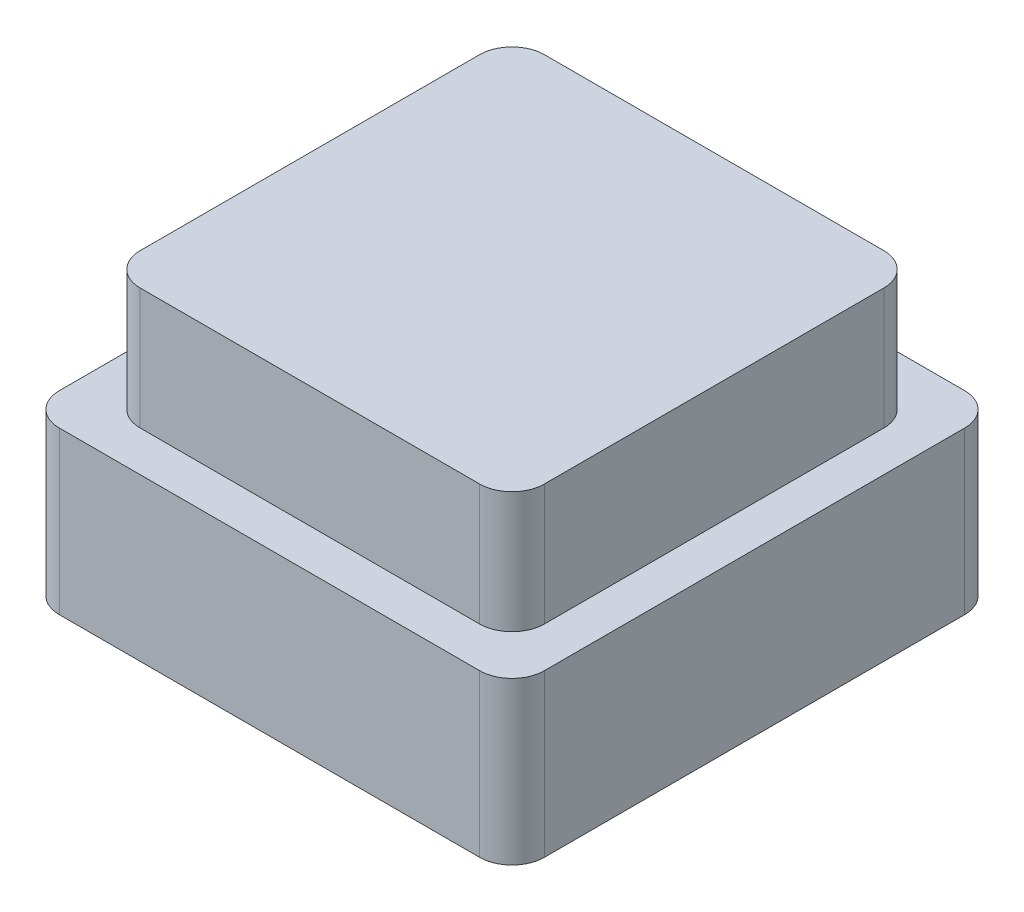
ISO-10303-21;
HEADER;
FILE_DESCRIPTION(('STEP AP214'),'2;1');
FILE_NAME('part.step','',(''),(''),'','','');
FILE_SCHEMA(('AUTOMOTIVE_DESIGN { 1 0 10303 214 1 1 1 1 }'));
ENDSEC;
DATA;
#1=APPLICATION_CONTEXT('core data for automotive mechanical design processes');
#2=APPLICATION_PROTOCOL_DEFINITION('international standard','automotive_design',2000,#1);
#3=PRODUCT_CONTEXT('',#1,'mechanical');
#4=PRODUCT('Part','Part','',(#3));
#5=PRODUCT_RELATED_PRODUCT_CATEGORY('part','',(#4));
#6=PRODUCT_DEFINITION_FORMATION('','',#4);
#7=PRODUCT_DEFINITION_CONTEXT('part definition',#1,'design');
#8=PRODUCT_DEFINITION('design','',#6,#7);
#9=PRODUCT_DEFINITION_SHAPE('','',#8);
#10=(LENGTH_UNIT() NAMED_UNIT(*) SI_UNIT(.MILLI.,.METRE.));
#11=(NAMED_UNIT(*) PLANE_ANGLE_UNIT() SI_UNIT($,.RADIAN.));
#12=(NAMED_UNIT(*) SI_UNIT($,.STERADIAN.) SOLID_ANGLE_UNIT());
#13=UNCERTAINTY_MEASURE_WITH_UNIT(LENGTH_MEASURE(1.E-05),#10,'distance_accuracy_value','');
#14=(GEOMETRIC_REPRESENTATION_CONTEXT(3) GLOBAL_UNCERTAINTY_ASSIGNED_CONTEXT((#13)) GLOBAL_UNIT_ASSIGNED_CONTEXT((#10,
#11,#12)) REPRESENTATION_CONTEXT('',''));
#15=CARTESIAN_POINT('',(0.,0.,0.));
#16=DIRECTION('',(0.,0.,1.));
#17=DIRECTION('',(1.,0.,0.));
#18=AXIS2_PLACEMENT_3D('',#15,#16,#17);
#19=CARTESIAN_POINT('',(0.,12.7,0.));
#20=DIRECTION('',(0.,-1.,0.));
#21=DIRECTION('',(0.,0.,-1.));
#22=AXIS2_PLACEMENT_3D('',#19,#20,#21);
#23=PLANE('',#22);
#24=DIRECTION('',(0.,0.,-1.));
#25=VECTOR('',#24,1.);
#26=CARTESIAN_POINT('',(19.05,12.7,19.05));
#27=LINE('',#26,#25);
#28=CARTESIAN_POINT('',(19.05,12.7,16.51));
#29=VERTEX_POINT('',#28);
#30=CARTESIAN_POINT('',(19.05,12.7,-16.51));
#31=VERTEX_POINT('',#30);
#32=EDGE_CURVE('E194',#29,#31,#27,.T.);
#33=ORIENTED_EDGE('',*,*,#32,.T.);
#34=CARTESIAN_POINT('',(16.51,12.7,-16.51));
#35=DIRECTION('',(0.,-1.,0.));
#36=DIRECTION('',(0.,0.,-1.));
#37=AXIS2_PLACEMENT_3D('',#34,#35,#36);
#38=CIRCLE('',#37,2.54);
#39=CARTESIAN_POINT('',(16.51,12.7,-19.05));
#40=VERTEX_POINT('',#39);
#41=EDGE_CURVE('E260',#31,#40,#38,.F.);
#42=ORIENTED_EDGE('',*,*,#41,.T.);
#43=DIRECTION('',(-1.,0.,0.));
#44=VECTOR('',#43,1.);
#45=CARTESIAN_POINT('',(-19.05,12.7,-19.05));
#46=LINE('',#45,#44);
#47=CARTESIAN_POINT('',(-16.51,12.7,-19.05));
#48=VERTEX_POINT('',#47);
#49=EDGE_CURVE('E198',#40,#48,#46,.T.);
#50=ORIENTED_EDGE('',*,*,#49,.T.);
#51=CARTESIAN_POINT('',(-16.51,12.7,-16.51));
#52=DIRECTION('',(0.,-1.,0.));
#53=DIRECTION('',(0.,0.,-1.));
#54=AXIS2_PLACEMENT_3D('',#51,#52,#53);
#55=CIRCLE('',#54,2.54);
#56=CARTESIAN_POINT('',(-19.05,12.7,-16.51));
#57=VERTEX_POINT('',#56);
#58=EDGE_CURVE('E257',#48,#57,#55,.F.);
#59=ORIENTED_EDGE('',*,*,#58,.T.);
#60=DIRECTION('',(0.,0.,1.));
#61=VECTOR('',#60,1.);
#62=CARTESIAN_POINT('',(-19.05,12.7,19.05));
#63=LINE('',#62,#61);
#64=CARTESIAN_POINT('',(-19.05,12.7,16.51));
#65=VERTEX_POINT('',#64);
#66=EDGE_CURVE('E203',#57,#65,#63,.T.);
#67=ORIENTED_EDGE('',*,*,#66,.T.);
#68=CARTESIAN_POINT('',(-16.51,12.7,16.51));
#69=DIRECTION('',(0.,-1.,0.));
#70=DIRECTION('',(0.,0.,-1.));
#71=AXIS2_PLACEMENT_3D('',#68,#69,#70);
#72=CIRCLE('',#71,2.54);
#73=CARTESIAN_POINT('',(-16.51,12.7,19.05));
#74=VERTEX_POINT('',#73);
#75=EDGE_CURVE('E254',#65,#74,#72,.F.);
#76=ORIENTED_EDGE('',*,*,#75,.T.);
#77=DIRECTION('',(1.,0.,0.));
#78=VECTOR('',#77,1.);
#79=CARTESIAN_POINT('',(-19.05,12.7,19.05));
#80=LINE('',#79,#78);
#81=CARTESIAN_POINT('',(16.51,12.7,19.05));
#82=VERTEX_POINT('',#81);
#83=EDGE_CURVE('E207',#74,#82,#80,.T.);
#84=ORIENTED_EDGE('',*,*,#83,.T.);
#85=CARTESIAN_POINT('',(16.51,12.7,16.51));
#86=DIRECTION('',(0.,-1.,0.));
#87=DIRECTION('',(0.,0.,-1.));
#88=AXIS2_PLACEMENT_3D('',#85,#86,#87);
#89=CIRCLE('',#88,2.54);
#90=EDGE_CURVE('E251',#82,#29,#89,.F.);
#91=ORIENTED_EDGE('',*,*,#90,.T.);
#92=EDGE_LOOP('',(#33,#42,#50,#59,#67,#76,#84,#91));
#93=FACE_BOUND('',#92,.T.);
#94=DIRECTION('',(0.,0.,-1.));
#95=VECTOR('',#94,1.);
#96=CARTESIAN_POINT('',(15.875,12.7,0.));
#97=LINE('',#96,#95);
#98=CARTESIAN_POINT('',(15.875,12.7,13.335));
#99=VERTEX_POINT('',#98);
#100=CARTESIAN_POINT('',(15.875,12.7,-13.335));
#101=VERTEX_POINT('',#100);
#102=EDGE_CURVE('E175',#99,#101,#97,.T.);
#103=ORIENTED_EDGE('',*,*,#102,.F.);
#104=CARTESIAN_POINT('',(13.335,12.7,13.335));
#105=DIRECTION('',(0.,-1.,0.));
#106=DIRECTION('',(0.,0.,-1.));
#107=AXIS2_PLACEMENT_3D('',#104,#105,#106);
#108=CIRCLE('',#107,2.54);
#109=CARTESIAN_POINT('',(13.335,12.7,15.875));
#110=VERTEX_POINT('',#109);
#111=EDGE_CURVE('E48',#99,#110,#108,.T.);
#112=ORIENTED_EDGE('',*,*,#111,.T.);
#113=DIRECTION('',(1.,0.,0.));
#114=VECTOR('',#113,1.);
#115=CARTESIAN_POINT('',(0.,12.7,15.875));
#116=LINE('',#115,#114);
#117=CARTESIAN_POINT('',(-13.335,12.7,15.875));
#118=VERTEX_POINT('',#117);
#119=EDGE_CURVE('E54',#118,#110,#116,.T.);
#120=ORIENTED_EDGE('',*,*,#119,.F.);
#121=CARTESIAN_POINT('',(-13.335,12.7,13.335));
#122=DIRECTION('',(0.,-1.,0.));
#123=DIRECTION('',(0.,0.,-1.));
#124=AXIS2_PLACEMENT_3D('',#121,#122,#123);
#125=CIRCLE('',#124,2.54);
#126=CARTESIAN_POINT('',(-15.875,12.7,13.335));
#127=VERTEX_POINT('',#126);
#128=EDGE_CURVE('E11',#118,#127,#125,.T.);
#129=ORIENTED_EDGE('',*,*,#128,.T.);
#130=DIRECTION('',(0.,0.,1.));
#131=VECTOR('',#130,1.);
#132=CARTESIAN_POINT('',(-15.875,12.7,0.));
#133=LINE('',#132,#131);
#134=CARTESIAN_POINT('',(-15.875,12.7,-13.335));
#135=VERTEX_POINT('',#134);
#136=EDGE_CURVE('E188',#135,#127,#133,.T.);
#137=ORIENTED_EDGE('',*,*,#136,.F.);
#138=CARTESIAN_POINT('',(-13.335,12.7,-13.335));
#139=DIRECTION('',(0.,-1.,0.));
#140=DIRECTION('',(0.,0.,-1.));
#141=AXIS2_PLACEMENT_3D('',#138,#139,#140);
#142=CIRCLE('',#141,2.54);
#143=CARTESIAN_POINT('',(-13.335,12.7,-15.875));
#144=VERTEX_POINT('',#143);
#145=EDGE_CURVE('E280',#135,#144,#142,.T.);
#146=ORIENTED_EDGE('',*,*,#145,.T.);
#147=DIRECTION('',(-1.,0.,0.));
#148=VECTOR('',#147,1.);
#149=CARTESIAN_POINT('',(0.,12.7,-15.875));
#150=LINE('',#149,#148);
#151=CARTESIAN_POINT('',(13.335,12.7,-15.875));
#152=VERTEX_POINT('',#151);
#153=EDGE_CURVE('E179',#152,#144,#150,.T.);
#154=ORIENTED_EDGE('',*,*,#153,.F.);
#155=CARTESIAN_POINT('',(13.335,12.7,-13.335));
#156=DIRECTION('',(0.,-1.,0.));
#157=DIRECTION('',(0.,0.,-1.));
#158=AXIS2_PLACEMENT_3D('',#155,#156,#157);
#159=CIRCLE('',#158,2.54);
#160=EDGE_CURVE('E277',#152,#101,#159,.T.);
#161=ORIENTED_EDGE('',*,*,#160,.T.);
#162=EDGE_LOOP('',(#103,#112,#120,#129,#137,#146,#154,#161));
#163=FACE_BOUND('',#162,.T.);
#164=ADVANCED_FACE('F39',(#93,#163),#23,.F.);
#165=CARTESIAN_POINT('',(19.05,12.7,19.05));
#166=DIRECTION('',(-1.,0.,0.));
#167=DIRECTION('',(0.,0.,1.));
#168=AXIS2_PLACEMENT_3D('',#165,#166,#167);
#169=PLANE('',#168);
#170=DIRECTION('',(0.,0.,-1.));
#171=VECTOR('',#170,1.);
#172=CARTESIAN_POINT('',(19.05,0.,19.05));
#173=LINE('',#172,#171);
#174=CARTESIAN_POINT('',(19.05,0.,16.51));
#175=VERTEX_POINT('',#174);
#176=CARTESIAN_POINT('',(19.05,0.,-16.51));
#177=VERTEX_POINT('',#176);
#178=EDGE_CURVE('E193',#175,#177,#173,.T.);
#179=ORIENTED_EDGE('',*,*,#178,.T.);
#180=DIRECTION('',(0.,-1.,0.));
#181=VECTOR('',#180,1.);
#182=CARTESIAN_POINT('',(19.05,12.7,-16.51));
#183=LINE('',#182,#181);
#184=EDGE_CURVE('E248',#177,#31,#183,.F.);
#185=ORIENTED_EDGE('',*,*,#184,.T.);
#186=ORIENTED_EDGE('',*,*,#32,.F.);
#187=DIRECTION('',(0.,-1.,0.));
#188=VECTOR('',#187,1.);
#189=CARTESIAN_POINT('',(19.05,12.7,16.51));
#190=LINE('',#189,#188);
#191=EDGE_CURVE('E244',#29,#175,#190,.T.);
#192=ORIENTED_EDGE('',*,*,#191,.T.);
#193=EDGE_LOOP('',(#179,#185,#186,#192));
#194=FACE_BOUND('',#193,.T.);
#195=ADVANCED_FACE('F354',(#194),#169,.F.);
#196=CARTESIAN_POINT('',(-19.05,12.7,-19.05));
#197=DIRECTION('',(0.,0.,1.));
#198=DIRECTION('',(1.,0.,0.));
#199=AXIS2_PLACEMENT_3D('',#196,#197,#198);
#200=PLANE('',#199);
#201=ORIENTED_EDGE('',*,*,#49,.F.);
#202=DIRECTION('',(0.,-1.,0.));
#203=VECTOR('',#202,1.);
#204=CARTESIAN_POINT('',(16.51,12.7,-19.05));
#205=LINE('',#204,#203);
#206=CARTESIAN_POINT('',(16.51,0.,-19.05));
#207=VERTEX_POINT('',#206);
#208=EDGE_CURVE('E228',#40,#207,#205,.T.);
#209=ORIENTED_EDGE('',*,*,#208,.T.);
#210=DIRECTION('',(-1.,0.,0.));
#211=VECTOR('',#210,1.);
#212=CARTESIAN_POINT('',(-19.05,0.,-19.05));
#213=LINE('',#212,#211);
#214=CARTESIAN_POINT('',(-16.51,0.,-19.05));
#215=VERTEX_POINT('',#214);
#216=EDGE_CURVE('E215',#207,#215,#213,.T.);
#217=ORIENTED_EDGE('',*,*,#216,.T.);
#218=DIRECTION('',(0.,-1.,0.));
#219=VECTOR('',#218,1.);
#220=CARTESIAN_POINT('',(-16.51,12.7,-19.05));
#221=LINE('',#220,#219);
#222=EDGE_CURVE('E211',#215,#48,#221,.F.);
#223=ORIENTED_EDGE('',*,*,#222,.T.);
#224=EDGE_LOOP('',(#201,#209,#217,#223));
#225=FACE_BOUND('',#224,.T.);
#226=ADVANCED_FACE('F360',(#225),#200,.F.);
#227=CARTESIAN_POINT('',(-19.05,12.7,19.05));
#228=DIRECTION('',(1.,0.,0.));
#229=DIRECTION('',(0.,0.,-1.));
#230=AXIS2_PLACEMENT_3D('',#227,#228,#229);
#231=PLANE('',#230);
#232=ORIENTED_EDGE('',*,*,#66,.F.);
#233=DIRECTION('',(0.,-1.,0.));
#234=VECTOR('',#233,1.);
#235=CARTESIAN_POINT('',(-19.05,12.7,-16.51));
#236=LINE('',#235,#234);
#237=CARTESIAN_POINT('',(-19.05,0.,-16.51));
#238=VERTEX_POINT('',#237);
#239=EDGE_CURVE('E266',#57,#238,#236,.T.);
#240=ORIENTED_EDGE('',*,*,#239,.T.);
#241=DIRECTION('',(0.,0.,1.));
#242=VECTOR('',#241,1.);
#243=CARTESIAN_POINT('',(-19.05,0.,19.05));
#244=LINE('',#243,#242);
#245=CARTESIAN_POINT('',(-19.05,0.,16.51));
#246=VERTEX_POINT('',#245);
#247=EDGE_CURVE('E219',#238,#246,#244,.T.);
#248=ORIENTED_EDGE('',*,*,#247,.T.);
#249=DIRECTION('',(0.,-1.,0.));
#250=VECTOR('',#249,1.);
#251=CARTESIAN_POINT('',(-19.05,12.7,16.51));
#252=LINE('',#251,#250);
#253=EDGE_CURVE('E263',#246,#65,#252,.F.);
#254=ORIENTED_EDGE('',*,*,#253,.T.);
#255=EDGE_LOOP('',(#232,#240,#248,#254));
#256=FACE_BOUND('',#255,.T.);
#257=ADVANCED_FACE('F374',(#256),#231,.F.);
#258=CARTESIAN_POINT('',(-19.05,12.7,19.05));
#259=DIRECTION('',(0.,0.,-1.));
#260=DIRECTION('',(-1.,0.,0.));
#261=AXIS2_PLACEMENT_3D('',#258,#259,#260);
#262=PLANE('',#261);
#263=ORIENTED_EDGE('',*,*,#83,.F.);
#264=DIRECTION('',(0.,-1.,0.));
#265=VECTOR('',#264,1.);
#266=CARTESIAN_POINT('',(-16.51,12.7,19.05));
#267=LINE('',#266,#265);
#268=CARTESIAN_POINT('',(-16.51,0.,19.05));
#269=VERTEX_POINT('',#268);
#270=EDGE_CURVE('E273',#74,#269,#267,.T.);
#271=ORIENTED_EDGE('',*,*,#270,.T.);
#272=DIRECTION('',(1.,0.,0.));
#273=VECTOR('',#272,1.);
#274=CARTESIAN_POINT('',(-19.05,0.,19.05));
#275=LINE('',#274,#273);
#276=CARTESIAN_POINT('',(16.51,0.,19.05));
#277=VERTEX_POINT('',#276);
#278=EDGE_CURVE('E199',#269,#277,#275,.T.);
#279=ORIENTED_EDGE('',*,*,#278,.T.);
#280=DIRECTION('',(0.,-1.,0.));
#281=VECTOR('',#280,1.);
#282=CARTESIAN_POINT('',(16.51,12.7,19.05));
#283=LINE('',#282,#281);
#284=EDGE_CURVE('E270',#277,#82,#283,.F.);
#285=ORIENTED_EDGE('',*,*,#284,.T.);
#286=EDGE_LOOP('',(#263,#271,#279,#285));
#287=FACE_BOUND('',#286,.T.);
#288=ADVANCED_FACE('F370',(#287),#262,.F.);
#289=CARTESIAN_POINT('',(0.,0.,0.));
#290=DIRECTION('',(0.,-1.,0.));
#291=DIRECTION('',(0.,0.,-1.));
#292=AXIS2_PLACEMENT_3D('',#289,#290,#291);
#293=PLANE('',#292);
#294=ORIENTED_EDGE('',*,*,#216,.F.);
#295=CARTESIAN_POINT('',(16.51,0.,-16.51));
#296=DIRECTION('',(0.,-1.,0.));
#297=DIRECTION('',(0.,0.,-1.));
#298=AXIS2_PLACEMENT_3D('',#295,#296,#297);
#299=CIRCLE('',#298,2.54);
#300=EDGE_CURVE('E241',#207,#177,#299,.T.);
#301=ORIENTED_EDGE('',*,*,#300,.T.);
#302=ORIENTED_EDGE('',*,*,#178,.F.);
#303=CARTESIAN_POINT('',(16.51,0.,16.51));
#304=DIRECTION('',(0.,-1.,0.));
#305=DIRECTION('',(0.,0.,-1.));
#306=AXIS2_PLACEMENT_3D('',#303,#304,#305);
#307=CIRCLE('',#306,2.54);
#308=EDGE_CURVE('E232',#175,#277,#307,.T.);
#309=ORIENTED_EDGE('',*,*,#308,.T.);
#310=ORIENTED_EDGE('',*,*,#278,.F.);
#311=CARTESIAN_POINT('',(-16.51,0.,16.51));
#312=DIRECTION('',(0.,-1.,0.));
#313=DIRECTION('',(0.,0.,-1.));
#314=AXIS2_PLACEMENT_3D('',#311,#312,#313);
#315=CIRCLE('',#314,2.54);
#316=EDGE_CURVE('E235',#269,#246,#315,.T.);
#317=ORIENTED_EDGE('',*,*,#316,.T.);
#318=ORIENTED_EDGE('',*,*,#247,.F.);
#319=CARTESIAN_POINT('',(-16.51,0.,-16.51));
#320=DIRECTION('',(0.,-1.,0.));
#321=DIRECTION('',(0.,0.,-1.));
#322=AXIS2_PLACEMENT_3D('',#319,#320,#321);
#323=CIRCLE('',#322,2.54);
#324=EDGE_CURVE('E238',#238,#215,#323,.T.);
#325=ORIENTED_EDGE('',*,*,#324,.T.);
#326=EDGE_LOOP('',(#294,#301,#302,#309,#310,#317,#318,#325));
#327=FACE_BOUND('',#326,.T.);
#328=ADVANCED_FACE('F366',(#327),#293,.T.);
#329=CARTESIAN_POINT('',(16.51,12.7,-16.51));
#330=DIRECTION('',(0.,-1.,0.));
#331=DIRECTION('',(0.,0.,-1.));
#332=AXIS2_PLACEMENT_3D('',#329,#330,#331);
#333=CYLINDRICAL_SURFACE('',#332,2.54);
#334=ORIENTED_EDGE('',*,*,#41,.F.);
#335=ORIENTED_EDGE('',*,*,#184,.F.);
#336=ORIENTED_EDGE('',*,*,#300,.F.);
#337=ORIENTED_EDGE('',*,*,#208,.F.);
#338=EDGE_LOOP('',(#334,#335,#336,#337));
#339=FACE_BOUND('',#338,.T.);
#340=ADVANCED_FACE('F369',(#339),#333,.T.);
#341=CARTESIAN_POINT('',(-16.51,12.7,-16.51));
#342=DIRECTION('',(0.,-1.,0.));
#343=DIRECTION('',(0.,0.,-1.));
#344=AXIS2_PLACEMENT_3D('',#341,#342,#343);
#345=CYLINDRICAL_SURFACE('',#344,2.54);
#346=ORIENTED_EDGE('',*,*,#58,.F.);
#347=ORIENTED_EDGE('',*,*,#222,.F.);
#348=ORIENTED_EDGE('',*,*,#324,.F.);
#349=ORIENTED_EDGE('',*,*,#239,.F.);
#350=EDGE_LOOP('',(#346,#347,#348,#349));
#351=FACE_BOUND('',#350,.T.);
#352=ADVANCED_FACE('F384',(#351),#345,.T.);
#353=CARTESIAN_POINT('',(-16.51,12.7,16.51));
#354=DIRECTION('',(0.,-1.,0.));
#355=DIRECTION('',(0.,0.,-1.));
#356=AXIS2_PLACEMENT_3D('',#353,#354,#355);
#357=CYLINDRICAL_SURFACE('',#356,2.54);
#358=ORIENTED_EDGE('',*,*,#75,.F.);
#359=ORIENTED_EDGE('',*,*,#253,.F.);
#360=ORIENTED_EDGE('',*,*,#316,.F.);
#361=ORIENTED_EDGE('',*,*,#270,.F.);
#362=EDGE_LOOP('',(#358,#359,#360,#361));
#363=FACE_BOUND('',#362,.T.);
#364=ADVANCED_FACE('F387',(#363),#357,.T.);
#365=CARTESIAN_POINT('',(16.51,12.7,16.51));
#366=DIRECTION('',(0.,-1.,0.));
#367=DIRECTION('',(0.,0.,-1.));
#368=AXIS2_PLACEMENT_3D('',#365,#366,#367);
#369=CYLINDRICAL_SURFACE('',#368,2.54);
#370=ORIENTED_EDGE('',*,*,#90,.F.);
#371=ORIENTED_EDGE('',*,*,#284,.F.);
#372=ORIENTED_EDGE('',*,*,#308,.F.);
#373=ORIENTED_EDGE('',*,*,#191,.F.);
#374=EDGE_LOOP('',(#370,#371,#372,#373));
#375=FACE_BOUND('',#374,.T.);
#376=ADVANCED_FACE('F41',(#375),#369,.T.);
#377=CARTESIAN_POINT('',(13.335,22.225,13.335));
#378=DIRECTION('',(0.,-1.,0.));
#379=DIRECTION('',(0.,0.,-1.));
#380=AXIS2_PLACEMENT_3D('',#377,#378,#379);
#381=CYLINDRICAL_SURFACE('',#380,2.54);
#382=DIRECTION('',(0.,-1.,0.));
#383=VECTOR('',#382,1.);
#384=CARTESIAN_POINT('',(13.335,22.225,15.875));
#385=LINE('',#384,#383);
#386=CARTESIAN_POINT('',(13.335,22.225,15.875));
#387=VERTEX_POINT('',#386);
#388=EDGE_CURVE('E286',#387,#110,#385,.T.);
#389=ORIENTED_EDGE('',*,*,#388,.T.);
#390=ORIENTED_EDGE('',*,*,#111,.F.);
#391=DIRECTION('',(0.,-1.,0.));
#392=VECTOR('',#391,1.);
#393=CARTESIAN_POINT('',(15.875,22.225,13.335));
#394=LINE('',#393,#392);
#395=CARTESIAN_POINT('',(15.875,22.225,13.335));
#396=VERTEX_POINT('',#395);
#397=EDGE_CURVE('E154',#396,#99,#394,.T.);
#398=ORIENTED_EDGE('',*,*,#397,.F.);
#399=CARTESIAN_POINT('',(13.335,22.225,13.335));
#400=DIRECTION('',(0.,1.,0.));
#401=DIRECTION('',(0.,0.,1.));
#402=AXIS2_PLACEMENT_3D('',#399,#400,#401);
#403=CIRCLE('',#402,2.54);
#404=EDGE_CURVE('E161',#387,#396,#403,.T.);
#405=ORIENTED_EDGE('',*,*,#404,.F.);
#406=EDGE_LOOP('',(#389,#390,#398,#405));
#407=FACE_BOUND('',#406,.T.);
#408=ADVANCED_FACE('F173',(#407),#381,.T.);
#409=CARTESIAN_POINT('',(13.335,22.225,-13.335));
#410=DIRECTION('',(0.,-1.,0.));
#411=DIRECTION('',(0.,0.,-1.));
#412=AXIS2_PLACEMENT_3D('',#409,#410,#411);
#413=CYLINDRICAL_SURFACE('',#412,2.54);
#414=DIRECTION('',(0.,-1.,0.));
#415=VECTOR('',#414,1.);
#416=CARTESIAN_POINT('',(15.875,22.225,-13.335));
#417=LINE('',#416,#415);
#418=CARTESIAN_POINT('',(15.875,22.225,-13.335));
#419=VERTEX_POINT('',#418);
#420=EDGE_CURVE('E156',#419,#101,#417,.T.);
#421=ORIENTED_EDGE('',*,*,#420,.T.);
#422=ORIENTED_EDGE('',*,*,#160,.F.);
#423=DIRECTION('',(0.,-1.,0.));
#424=VECTOR('',#423,1.);
#425=CARTESIAN_POINT('',(13.335,22.225,-15.875));
#426=LINE('',#425,#424);
#427=CARTESIAN_POINT('',(13.335,22.225,-15.875));
#428=VERTEX_POINT('',#427);
#429=EDGE_CURVE('E181',#428,#152,#426,.T.);
#430=ORIENTED_EDGE('',*,*,#429,.F.);
#431=CARTESIAN_POINT('',(13.335,22.225,-13.335));
#432=DIRECTION('',(0.,1.,0.));
#433=DIRECTION('',(0.,0.,1.));
#434=AXIS2_PLACEMENT_3D('',#431,#432,#433);
#435=CIRCLE('',#434,2.54);
#436=EDGE_CURVE('E160',#419,#428,#435,.T.);
#437=ORIENTED_EDGE('',*,*,#436,.F.);
#438=EDGE_LOOP('',(#421,#422,#430,#437));
#439=FACE_BOUND('',#438,.T.);
#440=ADVANCED_FACE('F319',(#439),#413,.T.);
#441=CARTESIAN_POINT('',(-13.335,22.225,-13.335));
#442=DIRECTION('',(0.,-1.,0.));
#443=DIRECTION('',(0.,0.,-1.));
#444=AXIS2_PLACEMENT_3D('',#441,#442,#443);
#445=CYLINDRICAL_SURFACE('',#444,2.54);
#446=DIRECTION('',(0.,-1.,0.));
#447=VECTOR('',#446,1.);
#448=CARTESIAN_POINT('',(-13.335,22.225,-15.875));
#449=LINE('',#448,#447);
#450=CARTESIAN_POINT('',(-13.335,22.225,-15.875));
#451=VERTEX_POINT('',#450);
#452=EDGE_CURVE('E306',#451,#144,#449,.T.);
#453=ORIENTED_EDGE('',*,*,#452,.T.);
#454=ORIENTED_EDGE('',*,*,#145,.F.);
#455=DIRECTION('',(0.,-1.,0.));
#456=VECTOR('',#455,1.);
#457=CARTESIAN_POINT('',(-15.875,22.225,-13.335));
#458=LINE('',#457,#456);
#459=CARTESIAN_POINT('',(-15.875,22.225,-13.335));
#460=VERTEX_POINT('',#459);
#461=EDGE_CURVE('E302',#460,#135,#458,.T.);
#462=ORIENTED_EDGE('',*,*,#461,.F.);
#463=CARTESIAN_POINT('',(-13.335,22.225,-13.335));
#464=DIRECTION('',(0.,1.,0.));
#465=DIRECTION('',(0.,0.,1.));
#466=AXIS2_PLACEMENT_3D('',#463,#464,#465);
#467=CIRCLE('',#466,2.54);
#468=EDGE_CURVE('E332',#451,#460,#467,.T.);
#469=ORIENTED_EDGE('',*,*,#468,.F.);
#470=EDGE_LOOP('',(#453,#454,#462,#469));
#471=FACE_BOUND('',#470,.T.);
#472=ADVANCED_FACE('F323',(#471),#445,.T.);
#473=CARTESIAN_POINT('',(-13.335,22.225,13.335));
#474=DIRECTION('',(0.,-1.,0.));
#475=DIRECTION('',(0.,0.,-1.));
#476=AXIS2_PLACEMENT_3D('',#473,#474,#475);
#477=CYLINDRICAL_SURFACE('',#476,2.54);
#478=DIRECTION('',(0.,-1.,0.));
#479=VECTOR('',#478,1.);
#480=CARTESIAN_POINT('',(-15.875,22.225,13.335));
#481=LINE('',#480,#479);
#482=CARTESIAN_POINT('',(-15.875,22.225,13.335));
#483=VERTEX_POINT('',#482);
#484=EDGE_CURVE('E293',#483,#127,#481,.T.);
#485=ORIENTED_EDGE('',*,*,#484,.T.);
#486=ORIENTED_EDGE('',*,*,#128,.F.);
#487=DIRECTION('',(0.,-1.,0.));
#488=VECTOR('',#487,1.);
#489=CARTESIAN_POINT('',(-13.335,22.225,15.875));
#490=LINE('',#489,#488);
#491=CARTESIAN_POINT('',(-13.335,22.225,15.875));
#492=VERTEX_POINT('',#491);
#493=EDGE_CURVE('E288',#492,#118,#490,.T.);
#494=ORIENTED_EDGE('',*,*,#493,.F.);
#495=CARTESIAN_POINT('',(-13.335,22.225,13.335));
#496=DIRECTION('',(0.,1.,0.));
#497=DIRECTION('',(0.,0.,1.));
#498=AXIS2_PLACEMENT_3D('',#495,#496,#497);
#499=CIRCLE('',#498,2.54);
#500=EDGE_CURVE('E295',#483,#492,#499,.T.);
#501=ORIENTED_EDGE('',*,*,#500,.F.);
#502=EDGE_LOOP('',(#485,#486,#494,#501));
#503=FACE_BOUND('',#502,.T.);
#504=ADVANCED_FACE('F342',(#503),#477,.T.);
#505=CARTESIAN_POINT('',(13.335,22.225,-15.875));
#506=DIRECTION('',(0.,0.,1.));
#507=DIRECTION('',(1.,0.,0.));
#508=AXIS2_PLACEMENT_3D('',#505,#506,#507);
#509=PLANE('',#508);
#510=ORIENTED_EDGE('',*,*,#429,.T.);
#511=ORIENTED_EDGE('',*,*,#153,.T.);
#512=ORIENTED_EDGE('',*,*,#452,.F.);
#513=DIRECTION('',(-1.,0.,0.));
#514=VECTOR('',#513,1.);
#515=CARTESIAN_POINT('',(13.335,22.225,-15.875));
#516=LINE('',#515,#514);
#517=EDGE_CURVE('E316',#428,#451,#516,.T.);
#518=ORIENTED_EDGE('',*,*,#517,.F.);
#519=EDGE_LOOP('',(#510,#511,#512,#518));
#520=FACE_BOUND('',#519,.T.);
#521=ADVANCED_FACE('F314',(#520),#509,.F.);
#522=CARTESIAN_POINT('',(15.875,22.225,13.335));
#523=DIRECTION('',(-1.,0.,0.));
#524=DIRECTION('',(0.,0.,1.));
#525=AXIS2_PLACEMENT_3D('',#522,#523,#524);
#526=PLANE('',#525);
#527=ORIENTED_EDGE('',*,*,#397,.T.);
#528=ORIENTED_EDGE('',*,*,#102,.T.);
#529=ORIENTED_EDGE('',*,*,#420,.F.);
#530=DIRECTION('',(0.,0.,-1.));
#531=VECTOR('',#530,1.);
#532=CARTESIAN_POINT('',(15.875,22.225,13.335));
#533=LINE('',#532,#531);
#534=EDGE_CURVE('E149',#396,#419,#533,.T.);
#535=ORIENTED_EDGE('',*,*,#534,.F.);
#536=EDGE_LOOP('',(#527,#528,#529,#535));
#537=FACE_BOUND('',#536,.T.);
#538=ADVANCED_FACE('F151',(#537),#526,.F.);
#539=CARTESIAN_POINT('',(-15.875,22.225,-13.335));
#540=DIRECTION('',(1.,0.,0.));
#541=DIRECTION('',(0.,0.,-1.));
#542=AXIS2_PLACEMENT_3D('',#539,#540,#541);
#543=PLANE('',#542);
#544=ORIENTED_EDGE('',*,*,#461,.T.);
#545=ORIENTED_EDGE('',*,*,#136,.T.);
#546=ORIENTED_EDGE('',*,*,#484,.F.);
#547=DIRECTION('',(0.,0.,1.));
#548=VECTOR('',#547,1.);
#549=CARTESIAN_POINT('',(-15.875,22.225,-13.335));
#550=LINE('',#549,#548);
#551=EDGE_CURVE('E329',#460,#483,#550,.T.);
#552=ORIENTED_EDGE('',*,*,#551,.F.);
#553=EDGE_LOOP('',(#544,#545,#546,#552));
#554=FACE_BOUND('',#553,.T.);
#555=ADVANCED_FACE('F327',(#554),#543,.F.);
#556=CARTESIAN_POINT('',(-13.335,22.225,15.875));
#557=DIRECTION('',(0.,0.,-1.));
#558=DIRECTION('',(-1.,0.,0.));
#559=AXIS2_PLACEMENT_3D('',#556,#557,#558);
#560=PLANE('',#559);
#561=ORIENTED_EDGE('',*,*,#493,.T.);
#562=ORIENTED_EDGE('',*,*,#119,.T.);
#563=ORIENTED_EDGE('',*,*,#388,.F.);
#564=DIRECTION('',(1.,0.,0.));
#565=VECTOR('',#564,1.);
#566=CARTESIAN_POINT('',(-13.335,22.225,15.875));
#567=LINE('',#566,#565);
#568=EDGE_CURVE('E166',#492,#387,#567,.T.);
#569=ORIENTED_EDGE('',*,*,#568,.F.);
#570=EDGE_LOOP('',(#561,#562,#563,#569));
#571=FACE_BOUND('',#570,.T.);
#572=ADVANCED_FACE('F285',(#571),#560,.F.);
#573=CARTESIAN_POINT('',(13.335,22.225,13.335));
#574=DIRECTION('',(0.,1.,0.));
#575=DIRECTION('',(0.,0.,1.));
#576=AXIS2_PLACEMENT_3D('',#573,#574,#575);
#577=PLANE('',#576);
#578=ORIENTED_EDGE('',*,*,#404,.T.);
#579=ORIENTED_EDGE('',*,*,#534,.T.);
#580=ORIENTED_EDGE('',*,*,#436,.T.);
#581=ORIENTED_EDGE('',*,*,#517,.T.);
#582=ORIENTED_EDGE('',*,*,#468,.T.);
#583=ORIENTED_EDGE('',*,*,#551,.T.);
#584=ORIENTED_EDGE('',*,*,#500,.T.);
#585=ORIENTED_EDGE('',*,*,#568,.T.);
#586=EDGE_LOOP('',(#578,#579,#580,#581,#582,#583,#584,#585));
#587=FACE_BOUND('',#586,.T.);
#588=ADVANCED_FACE('F164',(#587),#577,.T.);
#589=CLOSED_SHELL('',(#164,#195,#226,#257,#288,#328,#340,#352,#364,#376,#408,#440,#472,#504,
#521,#538,#555,#572,#588));
#590=MANIFOLD_SOLID_BREP('B2',#589);
#591=ADVANCED_BREP_SHAPE_REPRESENTATION('',(#18,#590),#14);
#592=SHAPE_DEFINITION_REPRESENTATION(#9,#591);
ENDSEC;
END-ISO-10303-21;
